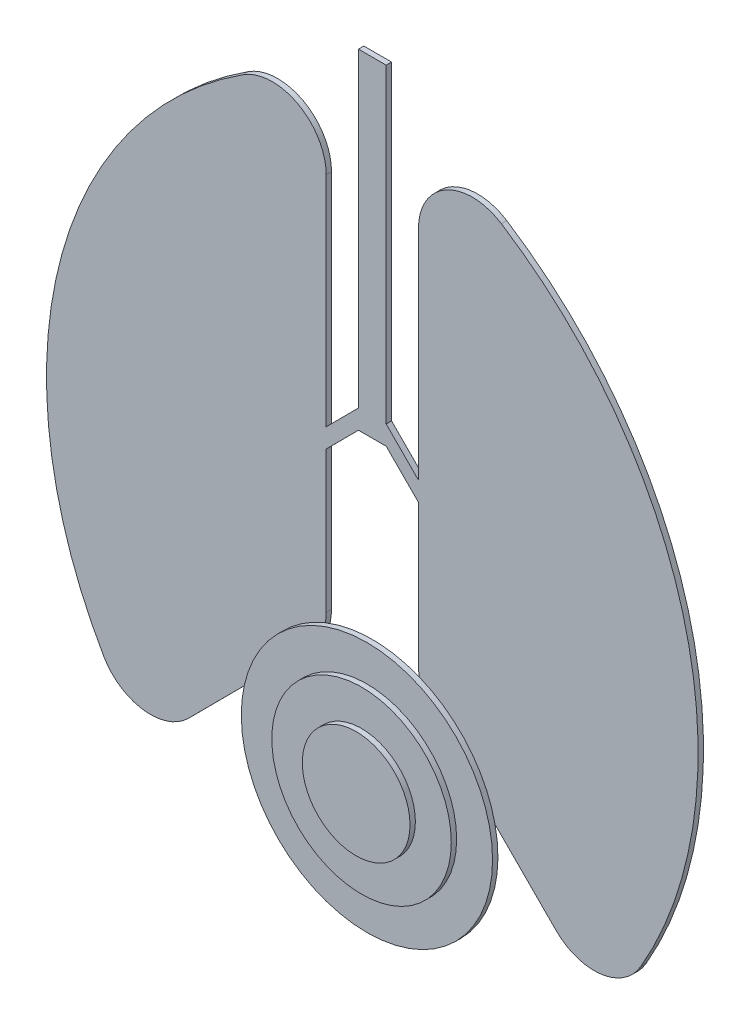
ISO-10303-21;
HEADER;
FILE_DESCRIPTION(('STEP AP214'),'2;1');
FILE_NAME('part.step','',(''),(''),'','','');
FILE_SCHEMA(('AUTOMOTIVE_DESIGN { 1 0 10303 214 1 1 1 1 }'));
ENDSEC;
DATA;
#1=APPLICATION_CONTEXT('core data for automotive mechanical design processes');
#2=APPLICATION_PROTOCOL_DEFINITION('international standard','automotive_design',2000,#1);
#3=PRODUCT_CONTEXT('',#1,'mechanical');
#4=PRODUCT('Part','Part','',(#3));
#5=PRODUCT_RELATED_PRODUCT_CATEGORY('part','',(#4));
#6=PRODUCT_DEFINITION_FORMATION('','',#4);
#7=PRODUCT_DEFINITION_CONTEXT('part definition',#1,'design');
#8=PRODUCT_DEFINITION('design','',#6,#7);
#9=PRODUCT_DEFINITION_SHAPE('','',#8);
#10=(LENGTH_UNIT() NAMED_UNIT(*) SI_UNIT(.MILLI.,.METRE.));
#11=(NAMED_UNIT(*) PLANE_ANGLE_UNIT() SI_UNIT($,.RADIAN.));
#12=(NAMED_UNIT(*) SI_UNIT($,.STERADIAN.) SOLID_ANGLE_UNIT());
#13=UNCERTAINTY_MEASURE_WITH_UNIT(LENGTH_MEASURE(1.E-05),#10,'distance_accuracy_value','');
#14=(GEOMETRIC_REPRESENTATION_CONTEXT(3) GLOBAL_UNCERTAINTY_ASSIGNED_CONTEXT((#13)) GLOBAL_UNIT_ASSIGNED_CONTEXT((#10,
#11,#12)) REPRESENTATION_CONTEXT('',''));
#15=CARTESIAN_POINT('',(0.,0.,0.));
#16=DIRECTION('',(0.,0.,1.));
#17=DIRECTION('',(1.,0.,0.));
#18=AXIS2_PLACEMENT_3D('',#15,#16,#17);
#19=CARTESIAN_POINT('',(-25.7272777281253,61.6477283347188,-3.));
#20=DIRECTION('',(1.,0.,0.));
#21=DIRECTION('',(0.,0.,-1.));
#22=AXIS2_PLACEMENT_3D('',#19,#20,#21);
#23=PLANE('',#22);
#24=DIRECTION('',(0.,1.,0.));
#25=VECTOR('',#24,1.);
#26=CARTESIAN_POINT('',(-25.7272777281253,61.6477283347188,0.));
#27=LINE('',#26,#25);
#28=CARTESIAN_POINT('',(-25.7272777281253,61.6477283347188,0.));
#29=VERTEX_POINT('',#28);
#30=CARTESIAN_POINT('',(-25.7272777281253,183.232578721302,0.));
#31=VERTEX_POINT('',#30);
#32=EDGE_CURVE('E227',#29,#31,#27,.T.);
#33=ORIENTED_EDGE('',*,*,#32,.F.);
#34=DIRECTION('',(0.,0.,1.));
#35=VECTOR('',#34,1.);
#36=CARTESIAN_POINT('',(-25.7272777281253,61.6477283347188,-3.));
#37=LINE('',#36,#35);
#38=CARTESIAN_POINT('',(-25.7272777281253,61.6477283347188,-3.));
#39=VERTEX_POINT('',#38);
#40=EDGE_CURVE('E231',#39,#29,#37,.T.);
#41=ORIENTED_EDGE('',*,*,#40,.F.);
#42=DIRECTION('',(0.,1.,0.));
#43=VECTOR('',#42,1.);
#44=CARTESIAN_POINT('',(-25.7272777281253,61.6477283347188,-3.));
#45=LINE('',#44,#43);
#46=CARTESIAN_POINT('',(-25.7272777281253,183.232578721302,-3.));
#47=VERTEX_POINT('',#46);
#48=EDGE_CURVE('E352',#39,#47,#45,.T.);
#49=ORIENTED_EDGE('',*,*,#48,.T.);
#50=DIRECTION('',(0.,0.,1.));
#51=VECTOR('',#50,1.);
#52=CARTESIAN_POINT('',(-25.7272777281253,183.232578721302,-3.));
#53=LINE('',#52,#51);
#54=EDGE_CURVE('E37',#47,#31,#53,.T.);
#55=ORIENTED_EDGE('',*,*,#54,.T.);
#56=EDGE_LOOP('',(#33,#41,#49,#55));
#57=FACE_BOUND('',#56,.T.);
#58=ADVANCED_FACE('F34',(#57),#23,.T.);
#59=CARTESIAN_POINT('',(-7.7329519683416,79.7325734138954,-3.));
#60=DIRECTION('',(-0.708878615970967,0.705330495455206,0.));
#61=DIRECTION('',(-0.705330495455206,-0.708878615970967,0.));
#62=AXIS2_PLACEMENT_3D('',#59,#60,#61);
#63=PLANE('',#62);
#64=DIRECTION('',(-0.705330495455206,-0.708878615970967,0.));
#65=VECTOR('',#64,1.);
#66=CARTESIAN_POINT('',(-7.7329519683416,79.7325734138954,0.));
#67=LINE('',#66,#65);
#68=CARTESIAN_POINT('',(-7.7329519683416,79.7325734138954,0.));
#69=VERTEX_POINT('',#68);
#70=EDGE_CURVE('E243',#69,#29,#67,.T.);
#71=ORIENTED_EDGE('',*,*,#70,.F.);
#72=DIRECTION('',(0.,0.,1.));
#73=VECTOR('',#72,1.);
#74=CARTESIAN_POINT('',(-7.7329519683416,79.7325734138954,-3.));
#75=LINE('',#74,#73);
#76=CARTESIAN_POINT('',(-7.7329519683416,79.7325734138954,-3.));
#77=VERTEX_POINT('',#76);
#78=EDGE_CURVE('E234',#77,#69,#75,.T.);
#79=ORIENTED_EDGE('',*,*,#78,.F.);
#80=DIRECTION('',(-0.705330495455206,-0.708878615970967,0.));
#81=VECTOR('',#80,1.);
#82=CARTESIAN_POINT('',(-7.7329519683416,79.7325734138954,-3.));
#83=LINE('',#82,#81);
#84=EDGE_CURVE('E288',#77,#39,#83,.T.);
#85=ORIENTED_EDGE('',*,*,#84,.T.);
#86=ORIENTED_EDGE('',*,*,#40,.T.);
#87=EDGE_LOOP('',(#71,#79,#85,#86));
#88=FACE_BOUND('',#87,.T.);
#89=ADVANCED_FACE('F418',(#88),#63,.T.);
#90=CARTESIAN_POINT('',(-7.73295196834161,171.945409861565,-3.));
#91=DIRECTION('',(-1.,0.,0.));
#92=DIRECTION('',(0.,-1.,0.));
#93=AXIS2_PLACEMENT_3D('',#90,#91,#92);
#94=PLANE('',#93);
#95=DIRECTION('',(0.,-1.,0.));
#96=VECTOR('',#95,1.);
#97=CARTESIAN_POINT('',(-7.73295196834161,171.945409861565,0.));
#98=LINE('',#97,#96);
#99=CARTESIAN_POINT('',(-7.73295196834161,252.911456322388,0.));
#100=VERTEX_POINT('',#99);
#101=EDGE_CURVE('E349',#100,#69,#98,.T.);
#102=ORIENTED_EDGE('',*,*,#101,.F.);
#103=DIRECTION('',(0.,0.,1.));
#104=VECTOR('',#103,1.);
#105=CARTESIAN_POINT('',(-7.73295196834161,252.911456322388,-3.));
#106=LINE('',#105,#104);
#107=CARTESIAN_POINT('',(-7.73295196834161,252.911456322388,-3.));
#108=VERTEX_POINT('',#107);
#109=EDGE_CURVE('E240',#108,#100,#106,.T.);
#110=ORIENTED_EDGE('',*,*,#109,.F.);
#111=DIRECTION('',(0.,-1.,0.));
#112=VECTOR('',#111,1.);
#113=CARTESIAN_POINT('',(-7.73295196834161,171.945409861565,-3.));
#114=LINE('',#113,#112);
#115=EDGE_CURVE('E291',#108,#77,#114,.T.);
#116=ORIENTED_EDGE('',*,*,#115,.T.);
#117=ORIENTED_EDGE('',*,*,#78,.T.);
#118=EDGE_LOOP('',(#102,#110,#116,#117));
#119=FACE_BOUND('',#118,.T.);
#120=ADVANCED_FACE('F417',(#119),#94,.T.);
#121=CARTESIAN_POINT('',(-7.73295196834161,252.911456322388,-3.));
#122=DIRECTION('',(0.,1.,0.));
#123=DIRECTION('',(0.,0.,1.));
#124=AXIS2_PLACEMENT_3D('',#121,#122,#123);
#125=PLANE('',#124);
#126=DIRECTION('',(-1.,0.,0.));
#127=VECTOR('',#126,1.);
#128=CARTESIAN_POINT('',(-7.73295196834161,252.911456322388,0.));
#129=LINE('',#128,#127);
#130=CARTESIAN_POINT('',(7.73295196834161,252.911456322388,0.));
#131=VERTEX_POINT('',#130);
#132=EDGE_CURVE('E347',#131,#100,#129,.T.);
#133=ORIENTED_EDGE('',*,*,#132,.F.);
#134=DIRECTION('',(0.,0.,1.));
#135=VECTOR('',#134,1.);
#136=CARTESIAN_POINT('',(7.73295196834161,252.911456322388,-3.));
#137=LINE('',#136,#135);
#138=CARTESIAN_POINT('',(7.73295196834161,252.911456322388,-3.));
#139=VERTEX_POINT('',#138);
#140=EDGE_CURVE('E248',#139,#131,#137,.T.);
#141=ORIENTED_EDGE('',*,*,#140,.F.);
#142=DIRECTION('',(-1.,0.,0.));
#143=VECTOR('',#142,1.);
#144=CARTESIAN_POINT('',(-7.73295196834161,252.911456322388,-3.));
#145=LINE('',#144,#143);
#146=EDGE_CURVE('E295',#139,#108,#145,.T.);
#147=ORIENTED_EDGE('',*,*,#146,.T.);
#148=ORIENTED_EDGE('',*,*,#109,.T.);
#149=EDGE_LOOP('',(#133,#141,#147,#148));
#150=FACE_BOUND('',#149,.T.);
#151=ADVANCED_FACE('F410',(#150),#125,.T.);
#152=CARTESIAN_POINT('',(7.73295196834161,252.911456322388,-3.));
#153=DIRECTION('',(1.,0.,0.));
#154=DIRECTION('',(0.,0.,-1.));
#155=AXIS2_PLACEMENT_3D('',#152,#153,#154);
#156=PLANE('',#155);
#157=DIRECTION('',(0.,1.,0.));
#158=VECTOR('',#157,1.);
#159=CARTESIAN_POINT('',(7.73295196834161,252.911456322388,0.));
#160=LINE('',#159,#158);
#161=CARTESIAN_POINT('',(7.7329519683416,79.7325734138954,0.));
#162=VERTEX_POINT('',#161);
#163=EDGE_CURVE('E344',#162,#131,#160,.T.);
#164=ORIENTED_EDGE('',*,*,#163,.F.);
#165=DIRECTION('',(0.,0.,1.));
#166=VECTOR('',#165,1.);
#167=CARTESIAN_POINT('',(7.7329519683416,79.7325734138954,-3.));
#168=LINE('',#167,#166);
#169=CARTESIAN_POINT('',(7.7329519683416,79.7325734138954,-3.));
#170=VERTEX_POINT('',#169);
#171=EDGE_CURVE('E250',#170,#162,#168,.T.);
#172=ORIENTED_EDGE('',*,*,#171,.F.);
#173=DIRECTION('',(0.,1.,0.));
#174=VECTOR('',#173,1.);
#175=CARTESIAN_POINT('',(7.73295196834161,171.945409861565,-3.));
#176=LINE('',#175,#174);
#177=EDGE_CURVE('E404',#170,#139,#176,.T.);
#178=ORIENTED_EDGE('',*,*,#177,.T.);
#179=ORIENTED_EDGE('',*,*,#140,.T.);
#180=EDGE_LOOP('',(#164,#172,#178,#179));
#181=FACE_BOUND('',#180,.T.);
#182=ADVANCED_FACE('F431',(#181),#156,.T.);
#183=CARTESIAN_POINT('',(7.7329519683416,79.7325734138954,-3.));
#184=DIRECTION('',(0.708878615970967,0.705330495455206,0.));
#185=DIRECTION('',(-0.705330495455206,0.708878615970967,0.));
#186=AXIS2_PLACEMENT_3D('',#183,#184,#185);
#187=PLANE('',#186);
#188=DIRECTION('',(-0.705330495455206,0.708878615970967,0.));
#189=VECTOR('',#188,1.);
#190=CARTESIAN_POINT('',(7.7329519683416,79.7325734138954,0.));
#191=LINE('',#190,#189);
#192=CARTESIAN_POINT('',(25.7272777281253,61.6477283347189,0.));
#193=VERTEX_POINT('',#192);
#194=EDGE_CURVE('E341',#193,#162,#191,.T.);
#195=ORIENTED_EDGE('',*,*,#194,.F.);
#196=DIRECTION('',(0.,0.,1.));
#197=VECTOR('',#196,1.);
#198=CARTESIAN_POINT('',(25.7272777281253,61.6477283347189,-3.));
#199=LINE('',#198,#197);
#200=CARTESIAN_POINT('',(25.7272777281253,61.6477283347189,-3.));
#201=VERTEX_POINT('',#200);
#202=EDGE_CURVE('E253',#201,#193,#199,.T.);
#203=ORIENTED_EDGE('',*,*,#202,.F.);
#204=DIRECTION('',(-0.705330495455206,0.708878615970967,0.));
#205=VECTOR('',#204,1.);
#206=CARTESIAN_POINT('',(7.7329519683416,79.7325734138954,-3.));
#207=LINE('',#206,#205);
#208=EDGE_CURVE('E401',#201,#170,#207,.T.);
#209=ORIENTED_EDGE('',*,*,#208,.T.);
#210=ORIENTED_EDGE('',*,*,#171,.T.);
#211=EDGE_LOOP('',(#195,#203,#209,#210));
#212=FACE_BOUND('',#211,.T.);
#213=ADVANCED_FACE('F434',(#212),#187,.T.);
#214=CARTESIAN_POINT('',(25.7272777281253,61.6477283347189,-3.));
#215=DIRECTION('',(-1.,0.,0.));
#216=DIRECTION('',(0.,0.,1.));
#217=AXIS2_PLACEMENT_3D('',#214,#215,#216);
#218=PLANE('',#217);
#219=DIRECTION('',(0.,-1.,0.));
#220=VECTOR('',#219,1.);
#221=CARTESIAN_POINT('',(25.7272777281253,61.6477283347189,0.));
#222=LINE('',#221,#220);
#223=CARTESIAN_POINT('',(25.7272777281253,183.232578721302,0.));
#224=VERTEX_POINT('',#223);
#225=EDGE_CURVE('E338',#224,#193,#222,.T.);
#226=ORIENTED_EDGE('',*,*,#225,.F.);
#227=DIRECTION('',(0.,0.,1.));
#228=VECTOR('',#227,1.);
#229=CARTESIAN_POINT('',(25.7272777281253,183.232578721302,-3.));
#230=LINE('',#229,#228);
#231=CARTESIAN_POINT('',(25.7272777281253,183.232578721302,-3.));
#232=VERTEX_POINT('',#231);
#233=EDGE_CURVE('E255',#232,#224,#230,.T.);
#234=ORIENTED_EDGE('',*,*,#233,.F.);
#235=DIRECTION('',(0.,-1.,0.));
#236=VECTOR('',#235,1.);
#237=CARTESIAN_POINT('',(25.7272777281253,61.6477283347189,-3.));
#238=LINE('',#237,#236);
#239=EDGE_CURVE('E398',#232,#201,#238,.T.);
#240=ORIENTED_EDGE('',*,*,#239,.T.);
#241=ORIENTED_EDGE('',*,*,#202,.T.);
#242=EDGE_LOOP('',(#226,#234,#240,#241));
#243=FACE_BOUND('',#242,.T.);
#244=ADVANCED_FACE('F438',(#243),#218,.T.);
#245=CARTESIAN_POINT('',(55.7272777281253,183.232578721302,-3.));
#246=DIRECTION('',(0.,0.,1.));
#247=DIRECTION('',(1.,0.,0.));
#248=AXIS2_PLACEMENT_3D('',#245,#246,#247);
#249=CYLINDRICAL_SURFACE('',#248,30.);
#250=CARTESIAN_POINT('',(55.7272777281253,183.232578721302,0.));
#251=DIRECTION('',(0.,0.,1.));
#252=DIRECTION('',(-1.,0.,0.));
#253=AXIS2_PLACEMENT_3D('',#250,#251,#252);
#254=CIRCLE('',#253,30.);
#255=CARTESIAN_POINT('',(71.9155590853539,208.490043889034,0.));
#256=VERTEX_POINT('',#255);
#257=EDGE_CURVE('E335',#256,#224,#254,.T.);
#258=ORIENTED_EDGE('',*,*,#257,.F.);
#259=DIRECTION('',(0.,0.,1.));
#260=VECTOR('',#259,1.);
#261=CARTESIAN_POINT('',(71.9155590853539,208.490043889034,-3.));
#262=LINE('',#261,#260);
#263=CARTESIAN_POINT('',(71.9155590853539,208.490043889034,-3.));
#264=VERTEX_POINT('',#263);
#265=EDGE_CURVE('E257',#264,#256,#262,.T.);
#266=ORIENTED_EDGE('',*,*,#265,.F.);
#267=CARTESIAN_POINT('',(55.7272777281253,183.232578721302,-3.));
#268=DIRECTION('',(0.,0.,1.));
#269=DIRECTION('',(-1.,0.,0.));
#270=AXIS2_PLACEMENT_3D('',#267,#268,#269);
#271=CIRCLE('',#270,30.);
#272=EDGE_CURVE('E395',#264,#232,#271,.T.);
#273=ORIENTED_EDGE('',*,*,#272,.T.);
#274=ORIENTED_EDGE('',*,*,#233,.T.);
#275=EDGE_LOOP('',(#258,#266,#273,#274));
#276=FACE_BOUND('',#275,.T.);
#277=ADVANCED_FACE('F442',(#276),#249,.T.);
#278=CARTESIAN_POINT('',(-56.5763533168831,8.01292527349669,-3.));
#279=DIRECTION('',(0.,0.,1.));
#280=DIRECTION('',(1.,0.,0.));
#281=AXIS2_PLACEMENT_3D('',#278,#279,#280);
#282=CYLINDRICAL_SURFACE('',#281,238.120235681834);
#283=CARTESIAN_POINT('',(-56.5763533168831,8.01292527349669,0.));
#284=DIRECTION('',(0.,0.,1.));
#285=DIRECTION('',(-1.,0.,0.));
#286=AXIS2_PLACEMENT_3D('',#283,#284,#285);
#287=CIRCLE('',#286,238.120235681834);
#288=CARTESIAN_POINT('',(149.593079249579,-111.131574038873,0.));
#289=VERTEX_POINT('',#288);
#290=EDGE_CURVE('E332',#289,#256,#287,.T.);
#291=ORIENTED_EDGE('',*,*,#290,.F.);
#292=DIRECTION('',(0.,0.,1.));
#293=VECTOR('',#292,1.);
#294=CARTESIAN_POINT('',(149.593079249579,-111.131574038873,-3.));
#295=LINE('',#294,#293);
#296=CARTESIAN_POINT('',(149.593079249579,-111.131574038873,-3.));
#297=VERTEX_POINT('',#296);
#298=EDGE_CURVE('E259',#297,#289,#295,.T.);
#299=ORIENTED_EDGE('',*,*,#298,.F.);
#300=CARTESIAN_POINT('',(-56.5763533168831,8.01292527349669,-3.));
#301=DIRECTION('',(0.,0.,1.));
#302=DIRECTION('',(-1.,0.,0.));
#303=AXIS2_PLACEMENT_3D('',#300,#301,#302);
#304=CIRCLE('',#303,238.120235681834);
#305=EDGE_CURVE('E392',#297,#264,#304,.T.);
#306=ORIENTED_EDGE('',*,*,#305,.T.);
#307=ORIENTED_EDGE('',*,*,#265,.T.);
#308=EDGE_LOOP('',(#291,#299,#306,#307));
#309=FACE_BOUND('',#308,.T.);
#310=ADVANCED_FACE('F446',(#309),#282,.T.);
#311=CARTESIAN_POINT('',(123.618457818169,-96.1209430896118,-3.));
#312=DIRECTION('',(0.,0.,1.));
#313=DIRECTION('',(1.,0.,0.));
#314=AXIS2_PLACEMENT_3D('',#311,#312,#313);
#315=CYLINDRICAL_SURFACE('',#314,30.);
#316=CARTESIAN_POINT('',(123.618457818169,-96.1209430896118,0.));
#317=DIRECTION('',(0.,0.,1.));
#318=DIRECTION('',(1.,0.,0.));
#319=AXIS2_PLACEMENT_3D('',#316,#317,#318);
#320=CIRCLE('',#319,30.);
#321=CARTESIAN_POINT('',(102.35209933904,-117.280857953268,0.));
#322=VERTEX_POINT('',#321);
#323=EDGE_CURVE('E329',#322,#289,#320,.T.);
#324=ORIENTED_EDGE('',*,*,#323,.F.);
#325=DIRECTION('',(0.,0.,1.));
#326=VECTOR('',#325,1.);
#327=CARTESIAN_POINT('',(102.35209933904,-117.280857953268,-3.));
#328=LINE('',#327,#326);
#329=CARTESIAN_POINT('',(102.35209933904,-117.280857953268,-3.));
#330=VERTEX_POINT('',#329);
#331=EDGE_CURVE('E261',#330,#322,#328,.T.);
#332=ORIENTED_EDGE('',*,*,#331,.F.);
#333=CARTESIAN_POINT('',(123.618457818169,-96.1209430896118,-3.));
#334=DIRECTION('',(0.,0.,1.));
#335=DIRECTION('',(1.,0.,0.));
#336=AXIS2_PLACEMENT_3D('',#333,#334,#335);
#337=CIRCLE('',#336,30.);
#338=EDGE_CURVE('E389',#330,#297,#337,.T.);
#339=ORIENTED_EDGE('',*,*,#338,.T.);
#340=ORIENTED_EDGE('',*,*,#298,.T.);
#341=EDGE_LOOP('',(#324,#332,#339,#340));
#342=FACE_BOUND('',#341,.T.);
#343=ADVANCED_FACE('F450',(#342),#315,.T.);
#344=CARTESIAN_POINT('',(34.4609192489964,-49.0481555691101,-3.));
#345=DIRECTION('',(-0.708878615970967,-0.705330495455206,0.));
#346=DIRECTION('',(0.705330495455206,-0.708878615970967,0.));
#347=AXIS2_PLACEMENT_3D('',#344,#345,#346);
#348=PLANE('',#347);
#349=DIRECTION('',(0.705330495455206,-0.708878615970967,0.));
#350=VECTOR('',#349,1.);
#351=CARTESIAN_POINT('',(34.4609192489964,-49.0481555691101,0.));
#352=LINE('',#351,#350);
#353=CARTESIAN_POINT('',(34.4609192489964,-49.0481555691101,0.));
#354=VERTEX_POINT('',#353);
#355=CARTESIAN_POINT('',(68.4020193271441,-83.1599942078202,0.));
#356=VERTEX_POINT('',#355);
#357=EDGE_CURVE('E327',#354,#356,#352,.T.);
#358=ORIENTED_EDGE('',*,*,#357,.F.);
#359=DIRECTION('',(0.,0.,1.));
#360=VECTOR('',#359,1.);
#361=CARTESIAN_POINT('',(34.4609192489964,-49.0481555691101,-3.));
#362=LINE('',#361,#360);
#363=CARTESIAN_POINT('',(34.4609192489964,-49.0481555691101,-3.));
#364=VERTEX_POINT('',#363);
#365=EDGE_CURVE('E208',#364,#354,#362,.T.);
#366=ORIENTED_EDGE('',*,*,#365,.F.);
#367=DIRECTION('',(0.705330495455206,-0.708878615970967,0.));
#368=VECTOR('',#367,1.);
#369=CARTESIAN_POINT('',(34.4609192489964,-49.0481555691101,-3.));
#370=LINE('',#369,#368);
#371=EDGE_CURVE('E386',#364,#330,#370,.T.);
#372=ORIENTED_EDGE('',*,*,#371,.T.);
#373=ORIENTED_EDGE('',*,*,#331,.T.);
#374=EDGE_CURVE('E201',#356,#322,#352,.T.);
#375=ORIENTED_EDGE('',*,*,#374,.F.);
#376=EDGE_LOOP('',(#358,#366,#372,#373,#375));
#377=FACE_BOUND('',#376,.T.);
#378=ADVANCED_FACE('F454',(#377),#348,.T.);
#379=CARTESIAN_POINT('',(55.7272777281253,-27.8882407054539,-3.));
#380=DIRECTION('',(0.,0.,1.));
#381=DIRECTION('',(1.,0.,0.));
#382=AXIS2_PLACEMENT_3D('',#379,#380,#381);
#383=CYLINDRICAL_SURFACE('',#382,30.);
#384=CARTESIAN_POINT('',(55.7272777281253,-27.8882407054539,0.));
#385=DIRECTION('',(0.,0.,1.));
#386=DIRECTION('',(1.,0.,0.));
#387=AXIS2_PLACEMENT_3D('',#384,#385,#386);
#388=CIRCLE('',#387,30.);
#389=CARTESIAN_POINT('',(25.7272777281254,-27.8882407054538,0.));
#390=VERTEX_POINT('',#389);
#391=CARTESIAN_POINT('',(26.1859169425095,-33.1139466801598,0.));
#392=VERTEX_POINT('',#391);
#393=EDGE_CURVE('E194',#390,#392,#388,.T.);
#394=ORIENTED_EDGE('',*,*,#393,.F.);
#395=DIRECTION('',(0.,0.,1.));
#396=VECTOR('',#395,1.);
#397=CARTESIAN_POINT('',(25.7272777281254,-27.8882407054538,-3.));
#398=LINE('',#397,#396);
#399=CARTESIAN_POINT('',(25.7272777281254,-27.8882407054538,-3.));
#400=VERTEX_POINT('',#399);
#401=EDGE_CURVE('E265',#400,#390,#398,.T.);
#402=ORIENTED_EDGE('',*,*,#401,.F.);
#403=CARTESIAN_POINT('',(55.7272777281253,-27.8882407054539,-3.));
#404=DIRECTION('',(0.,0.,1.));
#405=DIRECTION('',(1.,0.,0.));
#406=AXIS2_PLACEMENT_3D('',#403,#404,#405);
#407=CIRCLE('',#406,30.);
#408=EDGE_CURVE('E384',#400,#364,#407,.T.);
#409=ORIENTED_EDGE('',*,*,#408,.T.);
#410=ORIENTED_EDGE('',*,*,#365,.T.);
#411=EDGE_CURVE('E202',#392,#354,#388,.T.);
#412=ORIENTED_EDGE('',*,*,#411,.F.);
#413=EDGE_LOOP('',(#394,#402,#409,#410,#412));
#414=FACE_BOUND('',#413,.T.);
#415=ADVANCED_FACE('F206',(#414),#383,.T.);
#416=CARTESIAN_POINT('',(25.7272777281253,50.9160620242098,-3.));
#417=DIRECTION('',(-1.,0.,0.));
#418=DIRECTION('',(0.,0.,1.));
#419=AXIS2_PLACEMENT_3D('',#416,#417,#418);
#420=PLANE('',#419);
#421=DIRECTION('',(0.,-1.,0.));
#422=VECTOR('',#421,1.);
#423=CARTESIAN_POINT('',(25.7272777281253,50.9160620242098,0.));
#424=LINE('',#423,#422);
#425=CARTESIAN_POINT('',(25.7272777281253,50.9160620242098,0.));
#426=VERTEX_POINT('',#425);
#427=EDGE_CURVE('E199',#426,#390,#424,.T.);
#428=ORIENTED_EDGE('',*,*,#427,.F.);
#429=DIRECTION('',(0.,0.,1.));
#430=VECTOR('',#429,1.);
#431=CARTESIAN_POINT('',(25.7272777281253,50.9160620242098,-3.));
#432=LINE('',#431,#430);
#433=CARTESIAN_POINT('',(25.7272777281253,50.9160620242098,-3.));
#434=VERTEX_POINT('',#433);
#435=EDGE_CURVE('E267',#434,#426,#432,.T.);
#436=ORIENTED_EDGE('',*,*,#435,.F.);
#437=DIRECTION('',(0.,-1.,0.));
#438=VECTOR('',#437,1.);
#439=CARTESIAN_POINT('',(25.7272777281253,50.9160620242098,-3.));
#440=LINE('',#439,#438);
#441=EDGE_CURVE('E381',#434,#400,#440,.T.);
#442=ORIENTED_EDGE('',*,*,#441,.T.);
#443=ORIENTED_EDGE('',*,*,#401,.T.);
#444=EDGE_LOOP('',(#428,#436,#442,#443));
#445=FACE_BOUND('',#444,.T.);
#446=ADVANCED_FACE('F461',(#445),#420,.T.);
#447=CARTESIAN_POINT('',(7.73295196855162,69.0009071031752,-3.));
#448=DIRECTION('',(-0.708878615970966,-0.705330495455206,0.));
#449=DIRECTION('',(0.705330495455207,-0.708878615970966,0.));
#450=AXIS2_PLACEMENT_3D('',#447,#448,#449);
#451=PLANE('',#450);
#452=DIRECTION('',(0.705330495455207,-0.708878615970966,0.));
#453=VECTOR('',#452,1.);
#454=CARTESIAN_POINT('',(7.73295196855162,69.0009071031752,0.));
#455=LINE('',#454,#453);
#456=CARTESIAN_POINT('',(7.73295196855162,69.0009071031752,0.));
#457=VERTEX_POINT('',#456);
#458=EDGE_CURVE('E324',#457,#426,#455,.T.);
#459=ORIENTED_EDGE('',*,*,#458,.F.);
#460=DIRECTION('',(0.,0.,1.));
#461=VECTOR('',#460,1.);
#462=CARTESIAN_POINT('',(7.73295196855162,69.0009071031752,-3.));
#463=LINE('',#462,#461);
#464=CARTESIAN_POINT('',(7.73295196855162,69.0009071031752,-3.));
#465=VERTEX_POINT('',#464);
#466=EDGE_CURVE('E269',#465,#457,#463,.T.);
#467=ORIENTED_EDGE('',*,*,#466,.F.);
#468=DIRECTION('',(0.705330495455207,-0.708878615970966,0.));
#469=VECTOR('',#468,1.);
#470=CARTESIAN_POINT('',(7.73295196855162,69.0009071031752,-3.));
#471=LINE('',#470,#469);
#472=EDGE_CURVE('E378',#465,#434,#471,.T.);
#473=ORIENTED_EDGE('',*,*,#472,.T.);
#474=ORIENTED_EDGE('',*,*,#435,.T.);
#475=EDGE_LOOP('',(#459,#467,#473,#474));
#476=FACE_BOUND('',#475,.T.);
#477=ADVANCED_FACE('F464',(#476),#451,.T.);
#478=CARTESIAN_POINT('',(-7.73295196855162,69.0009071031752,-3.));
#479=DIRECTION('',(0.,-1.,0.));
#480=DIRECTION('',(1.,0.,0.));
#481=AXIS2_PLACEMENT_3D('',#478,#479,#480);
#482=PLANE('',#481);
#483=DIRECTION('',(1.,0.,0.));
#484=VECTOR('',#483,1.);
#485=CARTESIAN_POINT('',(-7.73295196855162,69.0009071031752,0.));
#486=LINE('',#485,#484);
#487=CARTESIAN_POINT('',(-7.73295196855162,69.0009071031752,0.));
#488=VERTEX_POINT('',#487);
#489=EDGE_CURVE('E321',#488,#457,#486,.T.);
#490=ORIENTED_EDGE('',*,*,#489,.F.);
#491=DIRECTION('',(0.,0.,1.));
#492=VECTOR('',#491,1.);
#493=CARTESIAN_POINT('',(-7.73295196855162,69.0009071031752,-3.));
#494=LINE('',#493,#492);
#495=CARTESIAN_POINT('',(-7.73295196855162,69.0009071031752,-3.));
#496=VERTEX_POINT('',#495);
#497=EDGE_CURVE('E271',#496,#488,#494,.T.);
#498=ORIENTED_EDGE('',*,*,#497,.F.);
#499=DIRECTION('',(1.,0.,0.));
#500=VECTOR('',#499,1.);
#501=CARTESIAN_POINT('',(-7.73295196855162,69.0009071031752,-3.));
#502=LINE('',#501,#500);
#503=EDGE_CURVE('E375',#496,#465,#502,.T.);
#504=ORIENTED_EDGE('',*,*,#503,.T.);
#505=ORIENTED_EDGE('',*,*,#466,.T.);
#506=EDGE_LOOP('',(#490,#498,#504,#505));
#507=FACE_BOUND('',#506,.T.);
#508=ADVANCED_FACE('F468',(#507),#482,.T.);
#509=CARTESIAN_POINT('',(-7.73295196855162,69.0009071031752,-3.));
#510=DIRECTION('',(0.708878615970967,-0.705330495455206,0.));
#511=DIRECTION('',(0.705330495455206,0.708878615970967,0.));
#512=AXIS2_PLACEMENT_3D('',#509,#510,#511);
#513=PLANE('',#512);
#514=DIRECTION('',(0.705330495455206,0.708878615970967,0.));
#515=VECTOR('',#514,1.);
#516=CARTESIAN_POINT('',(-7.73295196855162,69.0009071031752,0.));
#517=LINE('',#516,#515);
#518=CARTESIAN_POINT('',(-25.7272777281253,50.9160620242098,0.));
#519=VERTEX_POINT('',#518);
#520=EDGE_CURVE('E318',#519,#488,#517,.T.);
#521=ORIENTED_EDGE('',*,*,#520,.F.);
#522=DIRECTION('',(0.,0.,1.));
#523=VECTOR('',#522,1.);
#524=CARTESIAN_POINT('',(-25.7272777281253,50.9160620242098,-3.));
#525=LINE('',#524,#523);
#526=CARTESIAN_POINT('',(-25.7272777281253,50.9160620242098,-3.));
#527=VERTEX_POINT('',#526);
#528=EDGE_CURVE('E273',#527,#519,#525,.T.);
#529=ORIENTED_EDGE('',*,*,#528,.F.);
#530=DIRECTION('',(0.705330495455206,0.708878615970967,0.));
#531=VECTOR('',#530,1.);
#532=CARTESIAN_POINT('',(-7.73295196855162,69.0009071031752,-3.));
#533=LINE('',#532,#531);
#534=EDGE_CURVE('E372',#527,#496,#533,.T.);
#535=ORIENTED_EDGE('',*,*,#534,.T.);
#536=ORIENTED_EDGE('',*,*,#497,.T.);
#537=EDGE_LOOP('',(#521,#529,#535,#536));
#538=FACE_BOUND('',#537,.T.);
#539=ADVANCED_FACE('F472',(#538),#513,.T.);
#540=CARTESIAN_POINT('',(-25.7272777281253,50.9160620242098,-3.));
#541=DIRECTION('',(1.,0.,0.));
#542=DIRECTION('',(0.,0.,-1.));
#543=AXIS2_PLACEMENT_3D('',#540,#541,#542);
#544=PLANE('',#543);
#545=DIRECTION('',(0.,1.,0.));
#546=VECTOR('',#545,1.);
#547=CARTESIAN_POINT('',(-25.7272777281253,50.9160620242098,0.));
#548=LINE('',#547,#546);
#549=CARTESIAN_POINT('',(-25.7272777281253,-27.8882407054538,0.));
#550=VERTEX_POINT('',#549);
#551=EDGE_CURVE('E315',#550,#519,#548,.T.);
#552=ORIENTED_EDGE('',*,*,#551,.F.);
#553=DIRECTION('',(0.,0.,1.));
#554=VECTOR('',#553,1.);
#555=CARTESIAN_POINT('',(-25.7272777281253,-27.8882407054538,-3.));
#556=LINE('',#555,#554);
#557=CARTESIAN_POINT('',(-25.7272777281253,-27.8882407054538,-3.));
#558=VERTEX_POINT('',#557);
#559=EDGE_CURVE('E275',#558,#550,#556,.T.);
#560=ORIENTED_EDGE('',*,*,#559,.F.);
#561=DIRECTION('',(0.,1.,0.));
#562=VECTOR('',#561,1.);
#563=CARTESIAN_POINT('',(-25.7272777281253,50.9160620242098,-3.));
#564=LINE('',#563,#562);
#565=EDGE_CURVE('E369',#558,#527,#564,.T.);
#566=ORIENTED_EDGE('',*,*,#565,.T.);
#567=ORIENTED_EDGE('',*,*,#528,.T.);
#568=EDGE_LOOP('',(#552,#560,#566,#567));
#569=FACE_BOUND('',#568,.T.);
#570=ADVANCED_FACE('F476',(#569),#544,.T.);
#571=CARTESIAN_POINT('',(-55.7272777281253,-27.8882407054539,-3.));
#572=DIRECTION('',(0.,0.,1.));
#573=DIRECTION('',(1.,0.,0.));
#574=AXIS2_PLACEMENT_3D('',#571,#572,#573);
#575=CYLINDRICAL_SURFACE('',#574,30.);
#576=CARTESIAN_POINT('',(-55.7272777281253,-27.8882407054539,0.));
#577=DIRECTION('',(0.,0.,1.));
#578=DIRECTION('',(-1.,0.,0.));
#579=AXIS2_PLACEMENT_3D('',#576,#577,#578);
#580=CIRCLE('',#579,30.);
#581=CARTESIAN_POINT('',(-34.4609192489964,-49.0481555691102,0.));
#582=VERTEX_POINT('',#581);
#583=CARTESIAN_POINT('',(-26.1859169425095,-33.1139466801598,0.));
#584=VERTEX_POINT('',#583);
#585=EDGE_CURVE('E219',#582,#584,#580,.T.);
#586=ORIENTED_EDGE('',*,*,#585,.F.);
#587=DIRECTION('',(0.,0.,1.));
#588=VECTOR('',#587,1.);
#589=CARTESIAN_POINT('',(-34.4609192489964,-49.0481555691102,-3.));
#590=LINE('',#589,#588);
#591=CARTESIAN_POINT('',(-34.4609192489964,-49.0481555691102,-3.));
#592=VERTEX_POINT('',#591);
#593=EDGE_CURVE('E278',#592,#582,#590,.T.);
#594=ORIENTED_EDGE('',*,*,#593,.F.);
#595=CARTESIAN_POINT('',(-55.7272777281253,-27.8882407054539,-3.));
#596=DIRECTION('',(0.,0.,1.));
#597=DIRECTION('',(-1.,0.,0.));
#598=AXIS2_PLACEMENT_3D('',#595,#596,#597);
#599=CIRCLE('',#598,30.);
#600=EDGE_CURVE('E366',#592,#558,#599,.T.);
#601=ORIENTED_EDGE('',*,*,#600,.T.);
#602=ORIENTED_EDGE('',*,*,#559,.T.);
#603=EDGE_CURVE('E313',#584,#550,#580,.T.);
#604=ORIENTED_EDGE('',*,*,#603,.F.);
#605=EDGE_LOOP('',(#586,#594,#601,#602,#604));
#606=FACE_BOUND('',#605,.T.);
#607=ADVANCED_FACE('F480',(#606),#575,.T.);
#608=CARTESIAN_POINT('',(-34.4609192489964,-49.0481555691102,-3.));
#609=DIRECTION('',(0.708878615970967,-0.705330495455206,0.));
#610=DIRECTION('',(0.705330495455206,0.708878615970967,0.));
#611=AXIS2_PLACEMENT_3D('',#608,#609,#610);
#612=PLANE('',#611);
#613=DIRECTION('',(0.705330495455206,0.708878615970967,0.));
#614=VECTOR('',#613,1.);
#615=CARTESIAN_POINT('',(-34.4609192489964,-49.0481555691102,0.));
#616=LINE('',#615,#614);
#617=CARTESIAN_POINT('',(-102.35209933904,-117.280857953268,0.));
#618=VERTEX_POINT('',#617);
#619=CARTESIAN_POINT('',(-68.4020193271442,-83.1599942078203,0.));
#620=VERTEX_POINT('',#619);
#621=EDGE_CURVE('E311',#618,#620,#616,.T.);
#622=ORIENTED_EDGE('',*,*,#621,.F.);
#623=DIRECTION('',(0.,0.,1.));
#624=VECTOR('',#623,1.);
#625=CARTESIAN_POINT('',(-102.35209933904,-117.280857953268,-3.));
#626=LINE('',#625,#624);
#627=CARTESIAN_POINT('',(-102.35209933904,-117.280857953268,-3.));
#628=VERTEX_POINT('',#627);
#629=EDGE_CURVE('E280',#628,#618,#626,.T.);
#630=ORIENTED_EDGE('',*,*,#629,.F.);
#631=DIRECTION('',(0.705330495455206,0.708878615970967,0.));
#632=VECTOR('',#631,1.);
#633=CARTESIAN_POINT('',(-34.4609192489964,-49.0481555691102,-3.));
#634=LINE('',#633,#632);
#635=EDGE_CURVE('E363',#628,#592,#634,.T.);
#636=ORIENTED_EDGE('',*,*,#635,.T.);
#637=ORIENTED_EDGE('',*,*,#593,.T.);
#638=EDGE_CURVE('E310',#620,#582,#616,.T.);
#639=ORIENTED_EDGE('',*,*,#638,.F.);
#640=EDGE_LOOP('',(#622,#630,#636,#637,#639));
#641=FACE_BOUND('',#640,.T.);
#642=ADVANCED_FACE('F484',(#641),#612,.T.);
#643=CARTESIAN_POINT('',(-123.618457818169,-96.1209430896119,-3.));
#644=DIRECTION('',(0.,0.,1.));
#645=DIRECTION('',(1.,0.,0.));
#646=AXIS2_PLACEMENT_3D('',#643,#644,#645);
#647=CYLINDRICAL_SURFACE('',#646,30.);
#648=CARTESIAN_POINT('',(-123.618457818169,-96.1209430896119,0.));
#649=DIRECTION('',(0.,0.,1.));
#650=DIRECTION('',(-1.,0.,0.));
#651=AXIS2_PLACEMENT_3D('',#648,#649,#650);
#652=CIRCLE('',#651,30.);
#653=CARTESIAN_POINT('',(-149.593079249579,-111.131574038873,0.));
#654=VERTEX_POINT('',#653);
#655=EDGE_CURVE('E307',#654,#618,#652,.T.);
#656=ORIENTED_EDGE('',*,*,#655,.F.);
#657=DIRECTION('',(0.,0.,1.));
#658=VECTOR('',#657,1.);
#659=CARTESIAN_POINT('',(-149.593079249579,-111.131574038873,-3.));
#660=LINE('',#659,#658);
#661=CARTESIAN_POINT('',(-149.593079249579,-111.131574038873,-3.));
#662=VERTEX_POINT('',#661);
#663=EDGE_CURVE('E282',#662,#654,#660,.T.);
#664=ORIENTED_EDGE('',*,*,#663,.F.);
#665=CARTESIAN_POINT('',(-123.618457818169,-96.1209430896119,-3.));
#666=DIRECTION('',(0.,0.,1.));
#667=DIRECTION('',(-1.,0.,0.));
#668=AXIS2_PLACEMENT_3D('',#665,#666,#667);
#669=CIRCLE('',#668,30.);
#670=EDGE_CURVE('E360',#662,#628,#669,.T.);
#671=ORIENTED_EDGE('',*,*,#670,.T.);
#672=ORIENTED_EDGE('',*,*,#629,.T.);
#673=EDGE_LOOP('',(#656,#664,#671,#672));
#674=FACE_BOUND('',#673,.T.);
#675=ADVANCED_FACE('F488',(#674),#647,.T.);
#676=CARTESIAN_POINT('',(56.5763533168831,8.01292527349663,-3.));
#677=DIRECTION('',(0.,0.,1.));
#678=DIRECTION('',(1.,0.,0.));
#679=AXIS2_PLACEMENT_3D('',#676,#677,#678);
#680=CYLINDRICAL_SURFACE('',#679,238.120235681834);
#681=CARTESIAN_POINT('',(56.5763533168831,8.01292527349663,0.));
#682=DIRECTION('',(0.,0.,1.));
#683=DIRECTION('',(1.,0.,0.));
#684=AXIS2_PLACEMENT_3D('',#681,#682,#683);
#685=CIRCLE('',#684,238.120235681834);
#686=CARTESIAN_POINT('',(-71.9155590853539,208.490043889034,0.));
#687=VERTEX_POINT('',#686);
#688=EDGE_CURVE('E304',#687,#654,#685,.T.);
#689=ORIENTED_EDGE('',*,*,#688,.F.);
#690=DIRECTION('',(0.,0.,1.));
#691=VECTOR('',#690,1.);
#692=CARTESIAN_POINT('',(-71.9155590853539,208.490043889034,-3.));
#693=LINE('',#692,#691);
#694=CARTESIAN_POINT('',(-71.9155590853539,208.490043889034,-3.));
#695=VERTEX_POINT('',#694);
#696=EDGE_CURVE('E283',#695,#687,#693,.T.);
#697=ORIENTED_EDGE('',*,*,#696,.F.);
#698=CARTESIAN_POINT('',(56.5763533168831,8.01292527349663,-3.));
#699=DIRECTION('',(0.,0.,1.));
#700=DIRECTION('',(1.,0.,0.));
#701=AXIS2_PLACEMENT_3D('',#698,#699,#700);
#702=CIRCLE('',#701,238.120235681834);
#703=EDGE_CURVE('E355',#695,#662,#702,.T.);
#704=ORIENTED_EDGE('',*,*,#703,.T.);
#705=ORIENTED_EDGE('',*,*,#663,.T.);
#706=EDGE_LOOP('',(#689,#697,#704,#705));
#707=FACE_BOUND('',#706,.T.);
#708=ADVANCED_FACE('F492',(#707),#680,.T.);
#709=CARTESIAN_POINT('',(-55.7272777281253,183.232578721302,-3.));
#710=DIRECTION('',(0.,0.,1.));
#711=DIRECTION('',(1.,0.,0.));
#712=AXIS2_PLACEMENT_3D('',#709,#710,#711);
#713=CYLINDRICAL_SURFACE('',#712,30.);
#714=CARTESIAN_POINT('',(-55.7272777281253,183.232578721302,0.));
#715=DIRECTION('',(0.,0.,1.));
#716=DIRECTION('',(1.,0.,0.));
#717=AXIS2_PLACEMENT_3D('',#714,#715,#716);
#718=CIRCLE('',#717,30.);
#719=EDGE_CURVE('E301',#31,#687,#718,.T.);
#720=ORIENTED_EDGE('',*,*,#719,.F.);
#721=ORIENTED_EDGE('',*,*,#54,.F.);
#722=CARTESIAN_POINT('',(-55.7272777281253,183.232578721302,-3.));
#723=DIRECTION('',(0.,0.,1.));
#724=DIRECTION('',(1.,0.,0.));
#725=AXIS2_PLACEMENT_3D('',#722,#723,#724);
#726=CIRCLE('',#725,30.);
#727=EDGE_CURVE('E353',#47,#695,#726,.T.);
#728=ORIENTED_EDGE('',*,*,#727,.T.);
#729=ORIENTED_EDGE('',*,*,#696,.T.);
#730=EDGE_LOOP('',(#720,#721,#728,#729));
#731=FACE_BOUND('',#730,.T.);
#732=ADVANCED_FACE('F495',(#731),#713,.T.);
#733=CARTESIAN_POINT('',(-55.7272777281253,183.232578721302,-3.));
#734=DIRECTION('',(0.,0.,1.));
#735=DIRECTION('',(1.,0.,0.));
#736=AXIS2_PLACEMENT_3D('',#733,#734,#735);
#737=PLANE('',#736);
#738=ORIENTED_EDGE('',*,*,#48,.F.);
#739=ORIENTED_EDGE('',*,*,#84,.F.);
#740=ORIENTED_EDGE('',*,*,#115,.F.);
#741=ORIENTED_EDGE('',*,*,#146,.F.);
#742=ORIENTED_EDGE('',*,*,#177,.F.);
#743=ORIENTED_EDGE('',*,*,#208,.F.);
#744=ORIENTED_EDGE('',*,*,#239,.F.);
#745=ORIENTED_EDGE('',*,*,#272,.F.);
#746=ORIENTED_EDGE('',*,*,#305,.F.);
#747=ORIENTED_EDGE('',*,*,#338,.F.);
#748=ORIENTED_EDGE('',*,*,#371,.F.);
#749=ORIENTED_EDGE('',*,*,#408,.F.);
#750=ORIENTED_EDGE('',*,*,#441,.F.);
#751=ORIENTED_EDGE('',*,*,#472,.F.);
#752=ORIENTED_EDGE('',*,*,#503,.F.);
#753=ORIENTED_EDGE('',*,*,#534,.F.);
#754=ORIENTED_EDGE('',*,*,#565,.F.);
#755=ORIENTED_EDGE('',*,*,#600,.F.);
#756=ORIENTED_EDGE('',*,*,#635,.F.);
#757=ORIENTED_EDGE('',*,*,#670,.F.);
#758=ORIENTED_EDGE('',*,*,#703,.F.);
#759=ORIENTED_EDGE('',*,*,#727,.F.);
#760=EDGE_LOOP('',(#738,#739,#740,#741,#742,#743,#744,#745,#746,#747,#748,#749,#750,#751,#752,
#753,#754,#755,#756,#757,#758,#759));
#761=FACE_BOUND('',#760,.T.);
#762=ADVANCED_FACE('F414',(#761),#737,.F.);
#763=CARTESIAN_POINT('',(-55.7272777281253,183.232578721302,0.));
#764=DIRECTION('',(0.,0.,1.));
#765=DIRECTION('',(1.,0.,0.));
#766=AXIS2_PLACEMENT_3D('',#763,#764,#765);
#767=PLANE('',#766);
#768=CARTESIAN_POINT('',(0.,-98.0315695100201,0.));
#769=DIRECTION('',(0.,0.,1.));
#770=DIRECTION('',(1.,0.,0.));
#771=AXIS2_PLACEMENT_3D('',#768,#769,#770);
#772=CIRCLE('',#771,70.);
#773=EDGE_CURVE('E50',#356,#392,#772,.T.);
#774=ORIENTED_EDGE('',*,*,#773,.F.);
#775=ORIENTED_EDGE('',*,*,#374,.T.);
#776=ORIENTED_EDGE('',*,*,#323,.T.);
#777=ORIENTED_EDGE('',*,*,#290,.T.);
#778=ORIENTED_EDGE('',*,*,#257,.T.);
#779=ORIENTED_EDGE('',*,*,#225,.T.);
#780=ORIENTED_EDGE('',*,*,#194,.T.);
#781=ORIENTED_EDGE('',*,*,#163,.T.);
#782=ORIENTED_EDGE('',*,*,#132,.T.);
#783=ORIENTED_EDGE('',*,*,#101,.T.);
#784=ORIENTED_EDGE('',*,*,#70,.T.);
#785=ORIENTED_EDGE('',*,*,#32,.T.);
#786=ORIENTED_EDGE('',*,*,#719,.T.);
#787=ORIENTED_EDGE('',*,*,#688,.T.);
#788=ORIENTED_EDGE('',*,*,#655,.T.);
#789=ORIENTED_EDGE('',*,*,#621,.T.);
#790=EDGE_CURVE('E57',#584,#620,#772,.T.);
#791=ORIENTED_EDGE('',*,*,#790,.F.);
#792=ORIENTED_EDGE('',*,*,#603,.T.);
#793=ORIENTED_EDGE('',*,*,#551,.T.);
#794=ORIENTED_EDGE('',*,*,#520,.T.);
#795=ORIENTED_EDGE('',*,*,#489,.T.);
#796=ORIENTED_EDGE('',*,*,#458,.T.);
#797=ORIENTED_EDGE('',*,*,#427,.T.);
#798=ORIENTED_EDGE('',*,*,#393,.T.);
#799=EDGE_LOOP('',(#774,#775,#776,#777,#778,#779,#780,#781,#782,#783,#784,#785,#786,#787,#788,
#789,#791,#792,#793,#794,#795,#796,#797,#798));
#800=FACE_BOUND('',#799,.T.);
#801=ADVANCED_FACE('F196',(#800),#767,.T.);
#802=CARTESIAN_POINT('',(0.,-98.0315695100201,0.));
#803=DIRECTION('',(0.,0.,1.));
#804=DIRECTION('',(1.,0.,0.));
#805=AXIS2_PLACEMENT_3D('',#802,#803,#804);
#806=PLANE('',#805);
#807=EDGE_CURVE('E221',#620,#356,#772,.T.);
#808=ORIENTED_EDGE('',*,*,#807,.F.);
#809=ORIENTED_EDGE('',*,*,#638,.T.);
#810=ORIENTED_EDGE('',*,*,#585,.T.);
#811=EDGE_CURVE('E214',#392,#584,#772,.T.);
#812=ORIENTED_EDGE('',*,*,#811,.F.);
#813=ORIENTED_EDGE('',*,*,#411,.T.);
#814=ORIENTED_EDGE('',*,*,#357,.T.);
#815=EDGE_LOOP('',(#808,#809,#810,#812,#813,#814));
#816=FACE_BOUND('',#815,.T.);
#817=ADVANCED_FACE('F216',(#816),#806,.F.);
#818=CARTESIAN_POINT('',(0.,-98.0315695100201,3.));
#819=DIRECTION('',(0.,0.,-1.));
#820=DIRECTION('',(-1.,0.,0.));
#821=AXIS2_PLACEMENT_3D('',#818,#819,#820);
#822=CYLINDRICAL_SURFACE('',#821,70.);
#823=CARTESIAN_POINT('',(0.,-98.0315695100201,3.));
#824=DIRECTION('',(0.,0.,1.));
#825=DIRECTION('',(1.,0.,0.));
#826=AXIS2_PLACEMENT_3D('',#823,#824,#825);
#827=CIRCLE('',#826,70.);
#828=CARTESIAN_POINT('',(70.,-98.0315695100201,3.));
#829=VERTEX_POINT('',#828);
#830=EDGE_CURVE('E225',#829,#829,#827,.T.);
#831=ORIENTED_EDGE('',*,*,#830,.F.);
#832=EDGE_LOOP('',(#831));
#833=FACE_BOUND('',#832,.T.);
#834=ORIENTED_EDGE('',*,*,#773,.T.);
#835=ORIENTED_EDGE('',*,*,#811,.T.);
#836=ORIENTED_EDGE('',*,*,#790,.T.);
#837=ORIENTED_EDGE('',*,*,#807,.T.);
#838=EDGE_LOOP('',(#834,#835,#836,#837));
#839=FACE_BOUND('',#838,.T.);
#840=ADVANCED_FACE('F224',(#833,#839),#822,.T.);
#841=CARTESIAN_POINT('',(0.,-98.0315695100201,3.));
#842=DIRECTION('',(0.,0.,1.));
#843=DIRECTION('',(1.,0.,0.));
#844=AXIS2_PLACEMENT_3D('',#841,#842,#843);
#845=PLANE('',#844);
#846=CARTESIAN_POINT('',(0.,-98.0315695100201,3.));
#847=DIRECTION('',(0.,0.,1.));
#848=DIRECTION('',(1.,0.,0.));
#849=AXIS2_PLACEMENT_3D('',#846,#847,#848);
#850=CIRCLE('',#849,50.);
#851=CARTESIAN_POINT('',(50.,-98.0315695100201,3.));
#852=VERTEX_POINT('',#851);
#853=EDGE_CURVE('E42',#852,#852,#850,.T.);
#854=ORIENTED_EDGE('',*,*,#853,.F.);
#855=EDGE_LOOP('',(#854));
#856=FACE_BOUND('',#855,.T.);
#857=ORIENTED_EDGE('',*,*,#830,.T.);
#858=EDGE_LOOP('',(#857));
#859=FACE_BOUND('',#858,.T.);
#860=ADVANCED_FACE('F535',(#856,#859),#845,.T.);
#861=CARTESIAN_POINT('',(0.,-98.0315695100201,6.));
#862=DIRECTION('',(0.,0.,-1.));
#863=DIRECTION('',(-1.,0.,0.));
#864=AXIS2_PLACEMENT_3D('',#861,#862,#863);
#865=CYLINDRICAL_SURFACE('',#864,50.);
#866=CARTESIAN_POINT('',(0.,-98.0315695100201,6.));
#867=DIRECTION('',(0.,0.,1.));
#868=DIRECTION('',(1.,0.,0.));
#869=AXIS2_PLACEMENT_3D('',#866,#867,#868);
#870=CIRCLE('',#869,50.);
#871=CARTESIAN_POINT('',(50.,-98.0315695100201,6.));
#872=VERTEX_POINT('',#871);
#873=EDGE_CURVE('E230',#872,#872,#870,.T.);
#874=ORIENTED_EDGE('',*,*,#873,.F.);
#875=EDGE_LOOP('',(#874));
#876=FACE_BOUND('',#875,.T.);
#877=ORIENTED_EDGE('',*,*,#853,.T.);
#878=EDGE_LOOP('',(#877));
#879=FACE_BOUND('',#878,.T.);
#880=ADVANCED_FACE('F541',(#876,#879),#865,.T.);
#881=CARTESIAN_POINT('',(0.,-98.0315695100201,6.));
#882=DIRECTION('',(0.,0.,1.));
#883=DIRECTION('',(1.,0.,0.));
#884=AXIS2_PLACEMENT_3D('',#881,#882,#883);
#885=PLANE('',#884);
#886=CARTESIAN_POINT('',(0.,-98.0315695100201,6.));
#887=DIRECTION('',(0.,0.,1.));
#888=DIRECTION('',(1.,0.,0.));
#889=AXIS2_PLACEMENT_3D('',#886,#887,#888);
#890=CIRCLE('',#889,30.);
#891=CARTESIAN_POINT('',(30.,-98.0315695100201,6.));
#892=VERTEX_POINT('',#891);
#893=EDGE_CURVE('E11',#892,#892,#890,.T.);
#894=ORIENTED_EDGE('',*,*,#893,.F.);
#895=EDGE_LOOP('',(#894));
#896=FACE_BOUND('',#895,.T.);
#897=ORIENTED_EDGE('',*,*,#873,.T.);
#898=EDGE_LOOP('',(#897));
#899=FACE_BOUND('',#898,.T.);
#900=ADVANCED_FACE('F545',(#896,#899),#885,.T.);
#901=CARTESIAN_POINT('',(0.,-98.0315695100201,9.));
#902=DIRECTION('',(0.,0.,-1.));
#903=DIRECTION('',(-1.,0.,0.));
#904=AXIS2_PLACEMENT_3D('',#901,#902,#903);
#905=CYLINDRICAL_SURFACE('',#904,30.);
#906=CARTESIAN_POINT('',(0.,-98.0315695100201,9.));
#907=DIRECTION('',(0.,0.,1.));
#908=DIRECTION('',(1.,0.,0.));
#909=AXIS2_PLACEMENT_3D('',#906,#907,#908);
#910=CIRCLE('',#909,30.);
#911=CARTESIAN_POINT('',(30.,-98.0315695100201,9.));
#912=VERTEX_POINT('',#911);
#913=EDGE_CURVE('E561',#912,#912,#910,.T.);
#914=ORIENTED_EDGE('',*,*,#913,.F.);
#915=EDGE_LOOP('',(#914));
#916=FACE_BOUND('',#915,.T.);
#917=ORIENTED_EDGE('',*,*,#893,.T.);
#918=EDGE_LOOP('',(#917));
#919=FACE_BOUND('',#918,.T.);
#920=ADVANCED_FACE('F549',(#916,#919),#905,.T.);
#921=CARTESIAN_POINT('',(0.,-98.0315695100201,9.));
#922=DIRECTION('',(0.,0.,1.));
#923=DIRECTION('',(1.,0.,0.));
#924=AXIS2_PLACEMENT_3D('',#921,#922,#923);
#925=PLANE('',#924);
#926=ORIENTED_EDGE('',*,*,#913,.T.);
#927=EDGE_LOOP('',(#926));
#928=FACE_BOUND('',#927,.T.);
#929=ADVANCED_FACE('F553',(#928),#925,.T.);
#930=CLOSED_SHELL('',(#58,#89,#120,#151,#182,#213,#244,#277,#310,#343,#378,#415,#446,#477,#508,
#539,#570,#607,#642,#675,#708,#732,#762,#801,#817,#840,#860,#880,#900,#920,#929));
#931=MANIFOLD_SOLID_BREP('B2',#930);
#932=ADVANCED_BREP_SHAPE_REPRESENTATION('',(#18,#931),#14);
#933=SHAPE_DEFINITION_REPRESENTATION(#9,#932);
ENDSEC;
END-ISO-10303-21;
